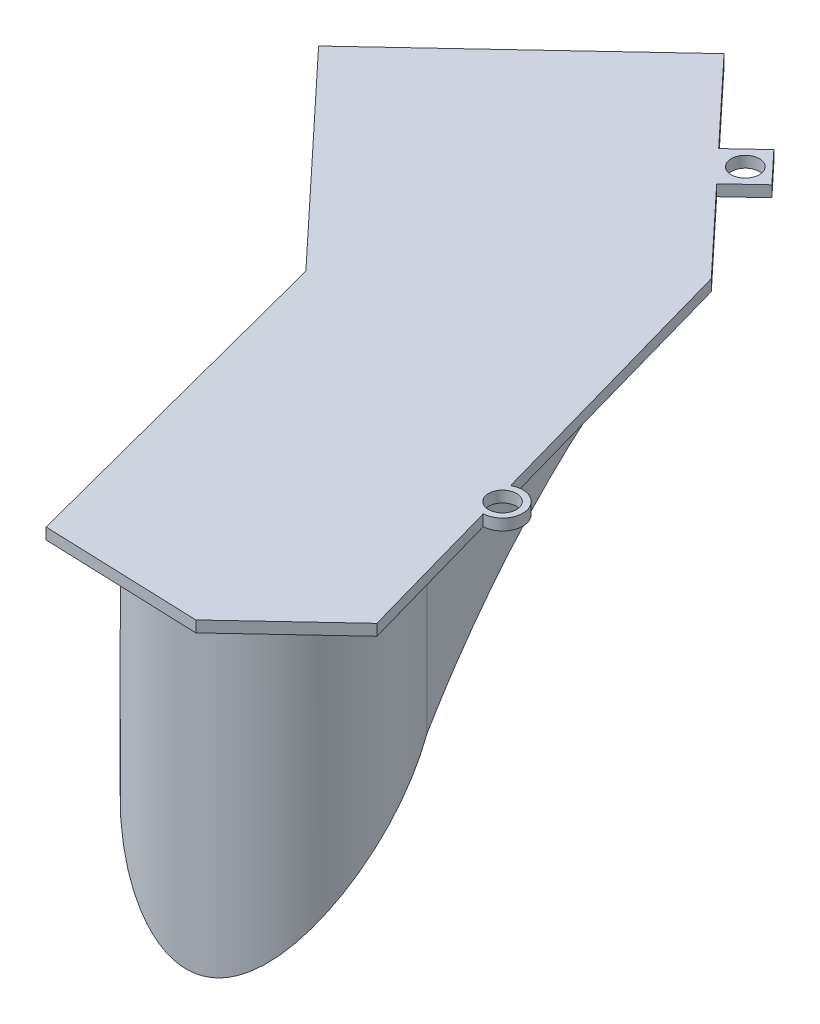
ISO-10303-21;
HEADER;
FILE_DESCRIPTION(('STEP AP214'),'2;1');
FILE_NAME('part.step','',(''),(''),'','','');
FILE_SCHEMA(('AUTOMOTIVE_DESIGN { 1 0 10303 214 1 1 1 1 }'));
ENDSEC;
DATA;
#1=APPLICATION_CONTEXT('core data for automotive mechanical design processes');
#2=APPLICATION_PROTOCOL_DEFINITION('international standard','automotive_design',2000,#1);
#3=PRODUCT_CONTEXT('',#1,'mechanical');
#4=PRODUCT('Part','Part','',(#3));
#5=PRODUCT_RELATED_PRODUCT_CATEGORY('part','',(#4));
#6=PRODUCT_DEFINITION_FORMATION('','',#4);
#7=PRODUCT_DEFINITION_CONTEXT('part definition',#1,'design');
#8=PRODUCT_DEFINITION('design','',#6,#7);
#9=PRODUCT_DEFINITION_SHAPE('','',#8);
#10=(LENGTH_UNIT() NAMED_UNIT(*) SI_UNIT(.MILLI.,.METRE.));
#11=(NAMED_UNIT(*) PLANE_ANGLE_UNIT() SI_UNIT($,.RADIAN.));
#12=(NAMED_UNIT(*) SI_UNIT($,.STERADIAN.) SOLID_ANGLE_UNIT());
#13=UNCERTAINTY_MEASURE_WITH_UNIT(LENGTH_MEASURE(1.E-05),#10,'distance_accuracy_value','');
#14=(GEOMETRIC_REPRESENTATION_CONTEXT(3) GLOBAL_UNCERTAINTY_ASSIGNED_CONTEXT((#13)) GLOBAL_UNIT_ASSIGNED_CONTEXT((#10,
#11,#12)) REPRESENTATION_CONTEXT('',''));
#15=CARTESIAN_POINT('',(0.,0.,0.));
#16=DIRECTION('',(0.,0.,1.));
#17=DIRECTION('',(1.,0.,0.));
#18=AXIS2_PLACEMENT_3D('',#15,#16,#17);
#19=CARTESIAN_POINT('',(109.633944272676,2.54,-22.6148228302141));
#20=DIRECTION('',(0.,1.,0.));
#21=DIRECTION('',(0.,0.,1.));
#22=AXIS2_PLACEMENT_3D('',#19,#20,#21);
#23=PLANE('',#22);
#24=CARTESIAN_POINT('',(71.405004974618,2.54,-115.884998779653));
#25=DIRECTION('',(0.,1.,0.));
#26=DIRECTION('',(0.,0.,1.));
#27=AXIS2_PLACEMENT_3D('',#24,#25,#26);
#28=CIRCLE('',#27,3.17500000000004);
#29=CARTESIAN_POINT('',(71.405004974618,2.54,-112.709998779653));
#30=VERTEX_POINT('',#29);
#31=EDGE_CURVE('E171',#30,#30,#28,.T.);
#32=ORIENTED_EDGE('',*,*,#31,.F.);
#33=EDGE_LOOP('',(#32));
#34=FACE_BOUND('',#33,.T.);
#35=DIRECTION('',(-0.729853070223345,0.,0.683604049055853));
#36=VECTOR('',#35,1.);
#37=CARTESIAN_POINT('',(46.8036282166022,2.54,-135.674028664743));
#38=LINE('',#37,#36);
#39=CARTESIAN_POINT('',(46.8036282166022,2.54,-135.674028664743));
#40=VERTEX_POINT('',#39);
#41=CARTESIAN_POINT('',(-0.667272367114391,2.54,-91.2112440642401));
#42=VERTEX_POINT('',#41);
#43=EDGE_CURVE('E192',#40,#42,#38,.T.);
#44=ORIENTED_EDGE('',*,*,#43,.T.);
#45=DIRECTION('',(0.683604049055853,0.,0.729853070223345));
#46=VECTOR('',#45,1.);
#47=CARTESIAN_POINT('',(-0.667272367114391,2.54,-91.2112440642401));
#48=LINE('',#47,#46);
#49=CARTESIAN_POINT('',(42.072585982005,2.54,-45.5798337762256));
#50=VERTEX_POINT('',#49);
#51=EDGE_CURVE('E113',#42,#50,#48,.T.);
#52=ORIENTED_EDGE('',*,*,#51,.T.);
#53=DIRECTION('',(0.252771208119308,0.,0.967526080447398));
#54=VECTOR('',#53,1.);
#55=CARTESIAN_POINT('',(42.072585982005,2.54,-45.5798337762256));
#56=LINE('',#55,#54);
#57=CARTESIAN_POINT('',(62.9001992959471,2.54,34.1415048392114));
#58=VERTEX_POINT('',#57);
#59=EDGE_CURVE('E300',#50,#58,#56,.T.);
#60=ORIENTED_EDGE('',*,*,#59,.T.);
#61=DIRECTION('',(0.999343312990486,0.,0.0362345523112806));
#62=VECTOR('',#61,1.);
#63=CARTESIAN_POINT('',(62.9001992959471,2.54,34.1415048392114));
#64=LINE('',#63,#62);
#65=CARTESIAN_POINT('',(98.1134511877565,2.54,35.4182796983996));
#66=VERTEX_POINT('',#65);
#67=EDGE_CURVE('E302',#58,#66,#64,.T.);
#68=ORIENTED_EDGE('',*,*,#67,.T.);
#69=DIRECTION('',(0.729853070223345,0.,-0.683604049055854));
#70=VECTOR('',#69,1.);
#71=CARTESIAN_POINT('',(98.1134511877565,2.54,35.4182796983996));
#72=LINE('',#71,#70);
#73=CARTESIAN_POINT('',(119.317385981979,2.54,15.5579868906825));
#74=VERTEX_POINT('',#73);
#75=EDGE_CURVE('E304',#66,#74,#72,.T.);
#76=ORIENTED_EDGE('',*,*,#75,.T.);
#77=DIRECTION('',(-0.27136827073141,0.,-0.962475590152937));
#78=VECTOR('',#77,1.);
#79=CARTESIAN_POINT('',(119.317385981979,2.54,15.5579868906825));
#80=LINE('',#79,#78);
#81=CARTESIAN_POINT('',(109.850299083421,2.54,-18.0194097045804));
#82=VERTEX_POINT('',#81);
#83=EDGE_CURVE('E306',#74,#82,#80,.T.);
#84=ORIENTED_EDGE('',*,*,#83,.T.);
#85=CARTESIAN_POINT('',(109.633944272676,2.54,-22.6148228302141));
#86=DIRECTION('',(0.,1.,0.));
#87=DIRECTION('',(0.,0.,1.));
#88=AXIS2_PLACEMENT_3D('',#85,#86,#87);
#89=CIRCLE('',#88,4.60050336369612);
#90=CARTESIAN_POINT('',(107.417924980056,2.54,-26.6464341326728));
#91=VERTEX_POINT('',#90);
#92=EDGE_CURVE('E308',#82,#91,#89,.T.);
#93=ORIENTED_EDGE('',*,*,#92,.T.);
#94=DIRECTION('',(-0.271368270731411,0.,-0.962475590152936));
#95=VECTOR('',#94,1.);
#96=CARTESIAN_POINT('',(107.417924980056,2.54,-26.6464341326728));
#97=LINE('',#96,#95);
#98=CARTESIAN_POINT('',(89.5434832542424,2.54,-90.042621912245));
#99=VERTEX_POINT('',#98);
#100=EDGE_CURVE('E310',#91,#99,#97,.T.);
#101=ORIENTED_EDGE('',*,*,#100,.T.);
#102=DIRECTION('',(-0.683604049055853,0.,-0.729853070223345));
#103=VECTOR('',#102,1.);
#104=CARTESIAN_POINT('',(89.5434832542424,2.54,-90.042621912245));
#105=LINE('',#104,#103);
#106=CARTESIAN_POINT('',(71.515910095554,2.54,-109.289844974655));
#107=VERTEX_POINT('',#106);
#108=EDGE_CURVE('E312',#99,#107,#105,.T.);
#109=ORIENTED_EDGE('',*,*,#108,.T.);
#110=DIRECTION('',(0.729853070223344,0.,-0.683604049055854));
#111=VECTOR('',#110,1.);
#112=CARTESIAN_POINT('',(71.515910095554,2.54,-109.289844974655));
#113=LINE('',#112,#111);
#114=CARTESIAN_POINT('',(77.9786055262348,2.54,-115.34301505021));
#115=VERTEX_POINT('',#114);
#116=EDGE_CURVE('E149',#107,#115,#113,.T.);
#117=ORIENTED_EDGE('',*,*,#116,.T.);
#118=DIRECTION('',(-0.683604049055854,0.,-0.729853070223344));
#119=VECTOR('',#118,1.);
#120=CARTESIAN_POINT('',(77.9786055262348,2.54,-115.34301505021));
#121=LINE('',#120,#119);
#122=CARTESIAN_POINT('',(71.2938968059717,2.54,-122.479975677888));
#123=VERTEX_POINT('',#122);
#124=EDGE_CURVE('E143',#115,#123,#121,.T.);
#125=ORIENTED_EDGE('',*,*,#124,.T.);
#126=DIRECTION('',(-0.729853070223345,0.,0.683604049055852));
#127=VECTOR('',#126,1.);
#128=CARTESIAN_POINT('',(71.2938968059717,2.54,-122.479975677888));
#129=LINE('',#128,#127);
#130=CARTESIAN_POINT('',(64.8312013752909,2.54,-116.426805602333));
#131=VERTEX_POINT('',#130);
#132=EDGE_CURVE('E147',#123,#131,#129,.T.);
#133=ORIENTED_EDGE('',*,*,#132,.T.);
#134=DIRECTION('',(-0.683604049055852,0.,-0.729853070223345));
#135=VECTOR('',#134,1.);
#136=CARTESIAN_POINT('',(64.8312013752909,2.54,-116.426805602333));
#137=LINE('',#136,#135);
#138=EDGE_CURVE('E53',#131,#40,#137,.T.);
#139=ORIENTED_EDGE('',*,*,#138,.T.);
#140=EDGE_LOOP('',(#44,#52,#60,#68,#76,#84,#93,#101,#109,#117,#125,#133,#139));
#141=FACE_BOUND('',#140,.T.);
#142=CARTESIAN_POINT('',(109.633944272676,2.54,-22.6148228302141));
#143=DIRECTION('',(0.,1.,0.));
#144=DIRECTION('',(0.,0.,1.));
#145=AXIS2_PLACEMENT_3D('',#142,#143,#144);
#146=CIRCLE('',#145,3.175);
#147=CARTESIAN_POINT('',(109.633944272676,2.54,-19.4398228302142));
#148=VERTEX_POINT('',#147);
#149=EDGE_CURVE('E287',#148,#148,#146,.T.);
#150=ORIENTED_EDGE('',*,*,#149,.F.);
#151=EDGE_LOOP('',(#150));
#152=FACE_BOUND('',#151,.T.);
#153=ADVANCED_FACE('F36',(#34,#141,#152),#23,.T.);
#154=CARTESIAN_POINT('',(109.633944272676,0.,-22.6148228302141));
#155=DIRECTION('',(0.,1.,0.));
#156=DIRECTION('',(0.,0.,1.));
#157=AXIS2_PLACEMENT_3D('',#154,#155,#156);
#158=PLANE('',#157);
#159=DIRECTION('',(-0.967526080447398,0.,0.252771208119308));
#160=VECTOR('',#159,1.);
#161=CARTESIAN_POINT('',(131.524213127208,0.,-88.9502593304301));
#162=LINE('',#161,#160);
#163=CARTESIAN_POINT('',(89.0058553055579,0.,-77.8421177608945));
#164=VERTEX_POINT('',#163);
#165=CARTESIAN_POINT('',(31.7878535270042,0.,-62.8936179446934));
#166=VERTEX_POINT('',#165);
#167=EDGE_CURVE('E239',#164,#166,#162,.T.);
#168=ORIENTED_EDGE('',*,*,#167,.T.);
#169=DIRECTION('',(0.683604049055853,0.,0.729853070223345));
#170=VECTOR('',#169,1.);
#171=CARTESIAN_POINT('',(88.2627801310738,0.,-2.5978975937881));
#172=LINE('',#171,#170);
#173=CARTESIAN_POINT('',(46.3531149335174,0.,-47.3429482685389));
#174=VERTEX_POINT('',#173);
#175=EDGE_CURVE('E222',#166,#174,#172,.T.);
#176=ORIENTED_EDGE('',*,*,#175,.T.);
#177=DIRECTION('',(0.247619469659392,0.,0.968857367338248));
#178=VECTOR('',#177,1.);
#179=CARTESIAN_POINT('',(56.1656782266344,0.,-8.9494638947684));
#180=LINE('',#179,#178);
#181=CARTESIAN_POINT('',(61.1366862999049,0.,10.500532511051));
#182=VERTEX_POINT('',#181);
#183=EDGE_CURVE('E225',#174,#182,#180,.T.);
#184=ORIENTED_EDGE('',*,*,#183,.T.);
#185=CARTESIAN_POINT('',(85.7747393565074,0.,4.32587935641606));
#186=DIRECTION('',(0.,1.,0.));
#187=DIRECTION('',(0.,0.,1.));
#188=AXIS2_PLACEMENT_3D('',#185,#186,#187);
#189=CIRCLE('',#188,25.4);
#190=CARTESIAN_POINT('',(108.844487247154,0.,-6.30176065733969));
#191=VERTEX_POINT('',#190);
#192=EDGE_CURVE('E228',#182,#191,#189,.T.);
#193=ORIENTED_EDGE('',*,*,#192,.T.);
#194=DIRECTION('',(-0.267222553945674,0.,-0.963634840934444));
#195=VECTOR('',#194,1.);
#196=CARTESIAN_POINT('',(104.700166234653,0.,-21.2466523242129));
#197=LINE('',#196,#195);
#198=EDGE_CURVE('E45',#191,#164,#197,.T.);
#199=ORIENTED_EDGE('',*,*,#198,.T.);
#200=EDGE_LOOP('',(#168,#176,#184,#193,#199));
#201=FACE_BOUND('',#200,.T.);
#202=DIRECTION('',(0.252771208119308,0.,0.967526080447398));
#203=VECTOR('',#202,1.);
#204=CARTESIAN_POINT('',(42.072585982005,0.,-45.5798337762256));
#205=LINE('',#204,#203);
#206=CARTESIAN_POINT('',(42.072585982005,0.,-45.5798337762256));
#207=VERTEX_POINT('',#206);
#208=CARTESIAN_POINT('',(62.9001992959471,0.,34.1415048392114));
#209=VERTEX_POINT('',#208);
#210=EDGE_CURVE('E173',#207,#209,#205,.T.);
#211=ORIENTED_EDGE('',*,*,#210,.F.);
#212=DIRECTION('',(0.683604049055853,0.,0.729853070223345));
#213=VECTOR('',#212,1.);
#214=CARTESIAN_POINT('',(-0.667272367114391,0.,-91.2112440642401));
#215=LINE('',#214,#213);
#216=CARTESIAN_POINT('',(-0.667272367114391,0.,-91.2112440642401));
#217=VERTEX_POINT('',#216);
#218=EDGE_CURVE('E170',#217,#207,#215,.T.);
#219=ORIENTED_EDGE('',*,*,#218,.F.);
#220=DIRECTION('',(-0.729853070223345,0.,0.683604049055853));
#221=VECTOR('',#220,1.);
#222=CARTESIAN_POINT('',(46.8036282166022,0.,-135.674028664743));
#223=LINE('',#222,#221);
#224=CARTESIAN_POINT('',(46.8036282166022,0.,-135.674028664743));
#225=VERTEX_POINT('',#224);
#226=EDGE_CURVE('E167',#225,#217,#223,.T.);
#227=ORIENTED_EDGE('',*,*,#226,.F.);
#228=DIRECTION('',(-0.683604049055852,0.,-0.729853070223345));
#229=VECTOR('',#228,1.);
#230=CARTESIAN_POINT('',(64.8312013752909,0.,-116.426805602333));
#231=LINE('',#230,#229);
#232=CARTESIAN_POINT('',(64.8312013752909,0.,-116.426805602333));
#233=VERTEX_POINT('',#232);
#234=EDGE_CURVE('E104',#233,#225,#231,.T.);
#235=ORIENTED_EDGE('',*,*,#234,.F.);
#236=DIRECTION('',(-0.729853070223345,0.,0.683604049055852));
#237=VECTOR('',#236,1.);
#238=CARTESIAN_POINT('',(71.2938968059717,0.,-122.479975677888));
#239=LINE('',#238,#237);
#240=CARTESIAN_POINT('',(71.2938968059717,0.,-122.479975677888));
#241=VERTEX_POINT('',#240);
#242=EDGE_CURVE('E98',#241,#233,#239,.T.);
#243=ORIENTED_EDGE('',*,*,#242,.F.);
#244=DIRECTION('',(-0.683604049055854,0.,-0.729853070223344));
#245=VECTOR('',#244,1.);
#246=CARTESIAN_POINT('',(77.9786055262348,0.,-115.34301505021));
#247=LINE('',#246,#245);
#248=CARTESIAN_POINT('',(77.9786055262348,0.,-115.34301505021));
#249=VERTEX_POINT('',#248);
#250=EDGE_CURVE('E157',#249,#241,#247,.T.);
#251=ORIENTED_EDGE('',*,*,#250,.F.);
#252=DIRECTION('',(0.729853070223344,0.,-0.683604049055854));
#253=VECTOR('',#252,1.);
#254=CARTESIAN_POINT('',(71.515910095554,0.,-109.289844974655));
#255=LINE('',#254,#253);
#256=CARTESIAN_POINT('',(71.515910095554,0.,-109.289844974655));
#257=VERTEX_POINT('',#256);
#258=EDGE_CURVE('E187',#257,#249,#255,.T.);
#259=ORIENTED_EDGE('',*,*,#258,.F.);
#260=DIRECTION('',(-0.683604049055853,0.,-0.729853070223345));
#261=VECTOR('',#260,1.);
#262=CARTESIAN_POINT('',(89.5434832542424,0.,-90.042621912245));
#263=LINE('',#262,#261);
#264=CARTESIAN_POINT('',(89.5434832542424,0.,-90.042621912245));
#265=VERTEX_POINT('',#264);
#266=EDGE_CURVE('E185',#265,#257,#263,.T.);
#267=ORIENTED_EDGE('',*,*,#266,.F.);
#268=DIRECTION('',(-0.271368270731411,0.,-0.962475590152936));
#269=VECTOR('',#268,1.);
#270=CARTESIAN_POINT('',(107.417924980056,0.,-26.6464341326728));
#271=LINE('',#270,#269);
#272=CARTESIAN_POINT('',(107.417924980056,0.,-26.6464341326728));
#273=VERTEX_POINT('',#272);
#274=EDGE_CURVE('E183',#273,#265,#271,.T.);
#275=ORIENTED_EDGE('',*,*,#274,.F.);
#276=CARTESIAN_POINT('',(109.633944272676,0.,-22.6148228302141));
#277=DIRECTION('',(0.,1.,0.));
#278=DIRECTION('',(0.,0.,1.));
#279=AXIS2_PLACEMENT_3D('',#276,#277,#278);
#280=CIRCLE('',#279,4.60050336369612);
#281=CARTESIAN_POINT('',(109.850299083421,0.,-18.0194097045804));
#282=VERTEX_POINT('',#281);
#283=EDGE_CURVE('E181',#282,#273,#280,.T.);
#284=ORIENTED_EDGE('',*,*,#283,.F.);
#285=DIRECTION('',(-0.27136827073141,0.,-0.962475590152937));
#286=VECTOR('',#285,1.);
#287=CARTESIAN_POINT('',(119.317385981979,0.,15.5579868906825));
#288=LINE('',#287,#286);
#289=CARTESIAN_POINT('',(119.317385981979,0.,15.5579868906825));
#290=VERTEX_POINT('',#289);
#291=EDGE_CURVE('E179',#290,#282,#288,.T.);
#292=ORIENTED_EDGE('',*,*,#291,.F.);
#293=DIRECTION('',(0.729853070223345,0.,-0.683604049055854));
#294=VECTOR('',#293,1.);
#295=CARTESIAN_POINT('',(98.1134511877565,0.,35.4182796983996));
#296=LINE('',#295,#294);
#297=CARTESIAN_POINT('',(98.1134511877565,0.,35.4182796983996));
#298=VERTEX_POINT('',#297);
#299=EDGE_CURVE('E177',#298,#290,#296,.T.);
#300=ORIENTED_EDGE('',*,*,#299,.F.);
#301=DIRECTION('',(0.999343312990486,0.,0.0362345523112806));
#302=VECTOR('',#301,1.);
#303=CARTESIAN_POINT('',(62.9001992959471,0.,34.1415048392114));
#304=LINE('',#303,#302);
#305=EDGE_CURVE('E175',#209,#298,#304,.T.);
#306=ORIENTED_EDGE('',*,*,#305,.F.);
#307=EDGE_LOOP('',(#211,#219,#227,#235,#243,#251,#259,#267,#275,#284,#292,#300,#306));
#308=FACE_BOUND('',#307,.T.);
#309=CARTESIAN_POINT('',(109.633944272676,0.,-22.6148228302141));
#310=DIRECTION('',(0.,1.,0.));
#311=DIRECTION('',(0.,0.,1.));
#312=AXIS2_PLACEMENT_3D('',#309,#310,#311);
#313=CIRCLE('',#312,3.175);
#314=CARTESIAN_POINT('',(109.633944272676,0.,-19.4398228302142));
#315=VERTEX_POINT('',#314);
#316=EDGE_CURVE('E291',#315,#315,#313,.T.);
#317=ORIENTED_EDGE('',*,*,#316,.T.);
#318=EDGE_LOOP('',(#317));
#319=FACE_BOUND('',#318,.T.);
#320=CARTESIAN_POINT('',(71.405004974618,0.,-115.884998779653));
#321=DIRECTION('',(0.,1.,0.));
#322=DIRECTION('',(0.,0.,1.));
#323=AXIS2_PLACEMENT_3D('',#320,#321,#322);
#324=CIRCLE('',#323,3.17500000000004);
#325=CARTESIAN_POINT('',(71.405004974618,0.,-112.709998779653));
#326=VERTEX_POINT('',#325);
#327=EDGE_CURVE('E290',#326,#326,#324,.T.);
#328=ORIENTED_EDGE('',*,*,#327,.T.);
#329=EDGE_LOOP('',(#328));
#330=FACE_BOUND('',#329,.T.);
#331=ADVANCED_FACE('F235',(#201,#308,#319,#330),#158,.F.);
#332=CARTESIAN_POINT('',(46.8036282166022,2.54,-135.674028664743));
#333=DIRECTION('',(0.683604049055853,0.,0.729853070223345));
#334=DIRECTION('',(0.729853070223345,0.,-0.683604049055853));
#335=AXIS2_PLACEMENT_3D('',#332,#333,#334);
#336=PLANE('',#335);
#337=ORIENTED_EDGE('',*,*,#226,.T.);
#338=DIRECTION('',(0.,-1.,0.));
#339=VECTOR('',#338,1.);
#340=CARTESIAN_POINT('',(-0.667272367114391,2.54,-91.2112440642401));
#341=LINE('',#340,#339);
#342=EDGE_CURVE('E220',#42,#217,#341,.T.);
#343=ORIENTED_EDGE('',*,*,#342,.F.);
#344=ORIENTED_EDGE('',*,*,#43,.F.);
#345=DIRECTION('',(0.,-1.,0.));
#346=VECTOR('',#345,1.);
#347=CARTESIAN_POINT('',(46.8036282166022,2.54,-135.674028664743));
#348=LINE('',#347,#346);
#349=EDGE_CURVE('E163',#40,#225,#348,.T.);
#350=ORIENTED_EDGE('',*,*,#349,.T.);
#351=EDGE_LOOP('',(#337,#343,#344,#350));
#352=FACE_BOUND('',#351,.T.);
#353=ADVANCED_FACE('F38',(#352),#336,.F.);
#354=CARTESIAN_POINT('',(-0.667272367114391,2.54,-91.2112440642401));
#355=DIRECTION('',(0.729853070223345,0.,-0.683604049055853));
#356=DIRECTION('',(-0.683604049055853,0.,-0.729853070223345));
#357=AXIS2_PLACEMENT_3D('',#354,#355,#356);
#358=PLANE('',#357);
#359=ORIENTED_EDGE('',*,*,#218,.T.);
#360=DIRECTION('',(0.,-1.,0.));
#361=VECTOR('',#360,1.);
#362=CARTESIAN_POINT('',(42.072585982005,2.54,-45.5798337762256));
#363=LINE('',#362,#361);
#364=EDGE_CURVE('E217',#50,#207,#363,.T.);
#365=ORIENTED_EDGE('',*,*,#364,.F.);
#366=ORIENTED_EDGE('',*,*,#51,.F.);
#367=ORIENTED_EDGE('',*,*,#342,.T.);
#368=EDGE_LOOP('',(#359,#365,#366,#367));
#369=FACE_BOUND('',#368,.T.);
#370=ADVANCED_FACE('F486',(#369),#358,.F.);
#371=CARTESIAN_POINT('',(42.072585982005,2.54,-45.5798337762256));
#372=DIRECTION('',(0.967526080447398,0.,-0.252771208119308));
#373=DIRECTION('',(-0.252771208119308,0.,-0.967526080447398));
#374=AXIS2_PLACEMENT_3D('',#371,#372,#373);
#375=PLANE('',#374);
#376=ORIENTED_EDGE('',*,*,#210,.T.);
#377=DIRECTION('',(0.,-1.,0.));
#378=VECTOR('',#377,1.);
#379=CARTESIAN_POINT('',(62.9001992959471,2.54,34.1415048392114));
#380=LINE('',#379,#378);
#381=EDGE_CURVE('E214',#58,#209,#380,.T.);
#382=ORIENTED_EDGE('',*,*,#381,.F.);
#383=ORIENTED_EDGE('',*,*,#59,.F.);
#384=ORIENTED_EDGE('',*,*,#364,.T.);
#385=EDGE_LOOP('',(#376,#382,#383,#384));
#386=FACE_BOUND('',#385,.T.);
#387=ADVANCED_FACE('F476',(#386),#375,.F.);
#388=CARTESIAN_POINT('',(62.9001992959471,2.54,34.1415048392114));
#389=DIRECTION('',(0.0362345523112806,0.,-0.999343312990486));
#390=DIRECTION('',(-0.999343312990486,0.,-0.0362345523112806));
#391=AXIS2_PLACEMENT_3D('',#388,#389,#390);
#392=PLANE('',#391);
#393=ORIENTED_EDGE('',*,*,#305,.T.);
#394=DIRECTION('',(0.,-1.,0.));
#395=VECTOR('',#394,1.);
#396=CARTESIAN_POINT('',(98.1134511877565,2.54,35.4182796983996));
#397=LINE('',#396,#395);
#398=EDGE_CURVE('E211',#66,#298,#397,.T.);
#399=ORIENTED_EDGE('',*,*,#398,.F.);
#400=ORIENTED_EDGE('',*,*,#67,.F.);
#401=ORIENTED_EDGE('',*,*,#381,.T.);
#402=EDGE_LOOP('',(#393,#399,#400,#401));
#403=FACE_BOUND('',#402,.T.);
#404=ADVANCED_FACE('F466',(#403),#392,.F.);
#405=CARTESIAN_POINT('',(98.1134511877565,2.54,35.4182796983996));
#406=DIRECTION('',(-0.683604049055853,0.,-0.729853070223345));
#407=DIRECTION('',(-0.729853070223345,0.,0.683604049055853));
#408=AXIS2_PLACEMENT_3D('',#405,#406,#407);
#409=PLANE('',#408);
#410=ORIENTED_EDGE('',*,*,#299,.T.);
#411=DIRECTION('',(0.,-1.,0.));
#412=VECTOR('',#411,1.);
#413=CARTESIAN_POINT('',(119.317385981979,2.54,15.5579868906825));
#414=LINE('',#413,#412);
#415=EDGE_CURVE('E208',#74,#290,#414,.T.);
#416=ORIENTED_EDGE('',*,*,#415,.F.);
#417=ORIENTED_EDGE('',*,*,#75,.F.);
#418=ORIENTED_EDGE('',*,*,#398,.T.);
#419=EDGE_LOOP('',(#410,#416,#417,#418));
#420=FACE_BOUND('',#419,.T.);
#421=ADVANCED_FACE('F456',(#420),#409,.F.);
#422=CARTESIAN_POINT('',(119.317385981979,2.54,15.5579868906825));
#423=DIRECTION('',(-0.962475590152937,0.,0.27136827073141));
#424=DIRECTION('',(0.27136827073141,0.,0.962475590152937));
#425=AXIS2_PLACEMENT_3D('',#422,#423,#424);
#426=PLANE('',#425);
#427=ORIENTED_EDGE('',*,*,#291,.T.);
#428=DIRECTION('',(0.,-1.,0.));
#429=VECTOR('',#428,1.);
#430=CARTESIAN_POINT('',(109.850299083421,2.54,-18.0194097045804));
#431=LINE('',#430,#429);
#432=EDGE_CURVE('E205',#82,#282,#431,.T.);
#433=ORIENTED_EDGE('',*,*,#432,.F.);
#434=ORIENTED_EDGE('',*,*,#83,.F.);
#435=ORIENTED_EDGE('',*,*,#415,.T.);
#436=EDGE_LOOP('',(#427,#433,#434,#435));
#437=FACE_BOUND('',#436,.T.);
#438=ADVANCED_FACE('F446',(#437),#426,.F.);
#439=CARTESIAN_POINT('',(109.633944272676,2.54,-22.6148228302141));
#440=DIRECTION('',(0.,-1.,0.));
#441=DIRECTION('',(0.,0.,-1.));
#442=AXIS2_PLACEMENT_3D('',#439,#440,#441);
#443=CYLINDRICAL_SURFACE('',#442,4.60050336369612);
#444=ORIENTED_EDGE('',*,*,#283,.T.);
#445=DIRECTION('',(0.,-1.,0.));
#446=VECTOR('',#445,1.);
#447=CARTESIAN_POINT('',(107.417924980056,2.54,-26.6464341326728));
#448=LINE('',#447,#446);
#449=EDGE_CURVE('E202',#91,#273,#448,.T.);
#450=ORIENTED_EDGE('',*,*,#449,.F.);
#451=ORIENTED_EDGE('',*,*,#92,.F.);
#452=ORIENTED_EDGE('',*,*,#432,.T.);
#453=EDGE_LOOP('',(#444,#450,#451,#452));
#454=FACE_BOUND('',#453,.T.);
#455=ADVANCED_FACE('F441',(#454),#443,.T.);
#456=CARTESIAN_POINT('',(107.417924980056,2.54,-26.6464341326728));
#457=DIRECTION('',(-0.962475590152937,0.,0.271368270731411));
#458=DIRECTION('',(0.271368270731411,0.,0.962475590152937));
#459=AXIS2_PLACEMENT_3D('',#456,#457,#458);
#460=PLANE('',#459);
#461=ORIENTED_EDGE('',*,*,#274,.T.);
#462=DIRECTION('',(0.,-1.,0.));
#463=VECTOR('',#462,1.);
#464=CARTESIAN_POINT('',(89.5434832542424,2.54,-90.042621912245));
#465=LINE('',#464,#463);
#466=EDGE_CURVE('E199',#99,#265,#465,.T.);
#467=ORIENTED_EDGE('',*,*,#466,.F.);
#468=ORIENTED_EDGE('',*,*,#100,.F.);
#469=ORIENTED_EDGE('',*,*,#449,.T.);
#470=EDGE_LOOP('',(#461,#467,#468,#469));
#471=FACE_BOUND('',#470,.T.);
#472=ADVANCED_FACE('F434',(#471),#460,.F.);
#473=CARTESIAN_POINT('',(89.5434832542424,2.54,-90.042621912245));
#474=DIRECTION('',(-0.729853070223345,0.,0.683604049055853));
#475=DIRECTION('',(0.683604049055853,0.,0.729853070223345));
#476=AXIS2_PLACEMENT_3D('',#473,#474,#475);
#477=PLANE('',#476);
#478=ORIENTED_EDGE('',*,*,#266,.T.);
#479=DIRECTION('',(0.,-1.,0.));
#480=VECTOR('',#479,1.);
#481=CARTESIAN_POINT('',(71.515910095554,2.54,-109.289844974655));
#482=LINE('',#481,#480);
#483=EDGE_CURVE('E196',#107,#257,#482,.T.);
#484=ORIENTED_EDGE('',*,*,#483,.F.);
#485=ORIENTED_EDGE('',*,*,#108,.F.);
#486=ORIENTED_EDGE('',*,*,#466,.T.);
#487=EDGE_LOOP('',(#478,#484,#485,#486));
#488=FACE_BOUND('',#487,.T.);
#489=ADVANCED_FACE('F318',(#488),#477,.F.);
#490=CARTESIAN_POINT('',(71.515910095554,2.54,-109.289844974655));
#491=DIRECTION('',(-0.683604049055854,0.,-0.729853070223344));
#492=DIRECTION('',(-0.729853070223344,0.,0.683604049055854));
#493=AXIS2_PLACEMENT_3D('',#490,#491,#492);
#494=PLANE('',#493);
#495=ORIENTED_EDGE('',*,*,#258,.T.);
#496=DIRECTION('',(0.,-1.,0.));
#497=VECTOR('',#496,1.);
#498=CARTESIAN_POINT('',(77.9786055262348,2.54,-115.34301505021));
#499=LINE('',#498,#497);
#500=EDGE_CURVE('E158',#115,#249,#499,.T.);
#501=ORIENTED_EDGE('',*,*,#500,.F.);
#502=ORIENTED_EDGE('',*,*,#116,.F.);
#503=ORIENTED_EDGE('',*,*,#483,.T.);
#504=EDGE_LOOP('',(#495,#501,#502,#503));
#505=FACE_BOUND('',#504,.T.);
#506=ADVANCED_FACE('F322',(#505),#494,.F.);
#507=CARTESIAN_POINT('',(77.9786055262348,2.54,-115.34301505021));
#508=DIRECTION('',(-0.729853070223344,0.,0.683604049055854));
#509=DIRECTION('',(0.683604049055854,0.,0.729853070223344));
#510=AXIS2_PLACEMENT_3D('',#507,#508,#509);
#511=PLANE('',#510);
#512=ORIENTED_EDGE('',*,*,#250,.T.);
#513=DIRECTION('',(0.,-1.,0.));
#514=VECTOR('',#513,1.);
#515=CARTESIAN_POINT('',(71.2938968059717,2.54,-122.479975677888));
#516=LINE('',#515,#514);
#517=EDGE_CURVE('E154',#123,#241,#516,.T.);
#518=ORIENTED_EDGE('',*,*,#517,.F.);
#519=ORIENTED_EDGE('',*,*,#124,.F.);
#520=ORIENTED_EDGE('',*,*,#500,.T.);
#521=EDGE_LOOP('',(#512,#518,#519,#520));
#522=FACE_BOUND('',#521,.T.);
#523=ADVANCED_FACE('F155',(#522),#511,.F.);
#524=CARTESIAN_POINT('',(71.2938968059717,2.54,-122.479975677888));
#525=DIRECTION('',(0.683604049055853,0.,0.729853070223346));
#526=DIRECTION('',(0.729853070223345,0.,-0.683604049055852));
#527=AXIS2_PLACEMENT_3D('',#524,#525,#526);
#528=PLANE('',#527);
#529=ORIENTED_EDGE('',*,*,#242,.T.);
#530=DIRECTION('',(0.,-1.,0.));
#531=VECTOR('',#530,1.);
#532=CARTESIAN_POINT('',(64.8312013752909,2.54,-116.426805602333));
#533=LINE('',#532,#531);
#534=EDGE_CURVE('E159',#131,#233,#533,.T.);
#535=ORIENTED_EDGE('',*,*,#534,.F.);
#536=ORIENTED_EDGE('',*,*,#132,.F.);
#537=ORIENTED_EDGE('',*,*,#517,.T.);
#538=EDGE_LOOP('',(#529,#535,#536,#537));
#539=FACE_BOUND('',#538,.T.);
#540=ADVANCED_FACE('F161',(#539),#528,.F.);
#541=CARTESIAN_POINT('',(64.8312013752909,2.54,-116.426805602333));
#542=DIRECTION('',(-0.729853070223346,0.,0.683604049055853));
#543=DIRECTION('',(0.683604049055852,0.,0.729853070223345));
#544=AXIS2_PLACEMENT_3D('',#541,#542,#543);
#545=PLANE('',#544);
#546=ORIENTED_EDGE('',*,*,#234,.T.);
#547=ORIENTED_EDGE('',*,*,#349,.F.);
#548=ORIENTED_EDGE('',*,*,#138,.F.);
#549=ORIENTED_EDGE('',*,*,#534,.T.);
#550=EDGE_LOOP('',(#546,#547,#548,#549));
#551=FACE_BOUND('',#550,.T.);
#552=ADVANCED_FACE('F329',(#551),#545,.F.);
#553=CARTESIAN_POINT('',(71.405004974618,2.54,-115.884998779653));
#554=DIRECTION('',(0.,-1.,0.));
#555=DIRECTION('',(0.,0.,-1.));
#556=AXIS2_PLACEMENT_3D('',#553,#554,#555);
#557=CYLINDRICAL_SURFACE('',#556,3.17500000000004);
#558=ORIENTED_EDGE('',*,*,#31,.T.);
#559=EDGE_LOOP('',(#558));
#560=FACE_BOUND('',#559,.T.);
#561=ORIENTED_EDGE('',*,*,#327,.F.);
#562=EDGE_LOOP('',(#561));
#563=FACE_BOUND('',#562,.T.);
#564=ADVANCED_FACE('F331',(#560,#563),#557,.F.);
#565=CARTESIAN_POINT('',(109.633944272676,2.54,-22.6148228302141));
#566=DIRECTION('',(0.,-1.,0.));
#567=DIRECTION('',(0.,0.,-1.));
#568=AXIS2_PLACEMENT_3D('',#565,#566,#567);
#569=CYLINDRICAL_SURFACE('',#568,3.175);
#570=ORIENTED_EDGE('',*,*,#149,.T.);
#571=EDGE_LOOP('',(#570));
#572=FACE_BOUND('',#571,.T.);
#573=ORIENTED_EDGE('',*,*,#316,.F.);
#574=EDGE_LOOP('',(#573));
#575=FACE_BOUND('',#574,.T.);
#576=ADVANCED_FACE('F337',(#572,#575),#569,.F.);
#577=CARTESIAN_POINT('',(86.4107962943836,-73.66,-87.2001949161513));
#578=DIRECTION('',(0.963634840934444,0.,-0.267222553945674));
#579=DIRECTION('',(-0.267222553945674,0.,-0.963634840934444));
#580=AXIS2_PLACEMENT_3D('',#577,#578,#579);
#581=PLANE('',#580);
#582=CARTESIAN_POINT('',(83.3339506925619,-140.64779078871,-98.2956491669705));
#583=DIRECTION('',(0.963634840934444,0.,-0.267222553945674));
#584=DIRECTION('',(-0.267222553945674,0.,-0.963634840934444));
#585=AXIS2_PLACEMENT_3D('',#582,#583,#584);
#586=ELLIPSE('',#585,142.255931465188,142.24);
#587=CARTESIAN_POINT('',(108.844487247154,-35.1935552448705,-6.30176065733969));
#588=VERTEX_POINT('',#587);
#589=EDGE_CURVE('E251',#164,#588,#586,.T.);
#590=ORIENTED_EDGE('',*,*,#589,.F.);
#591=ORIENTED_EDGE('',*,*,#198,.F.);
#592=DIRECTION('',(0.,1.,0.));
#593=VECTOR('',#592,1.);
#594=CARTESIAN_POINT('',(108.844487247154,-73.66,-6.30176065733969));
#595=LINE('',#594,#593);
#596=EDGE_CURVE('E249',#588,#191,#595,.T.);
#597=ORIENTED_EDGE('',*,*,#596,.F.);
#598=EDGE_LOOP('',(#590,#591,#597));
#599=FACE_BOUND('',#598,.T.);
#600=ADVANCED_FACE('F246',(#599),#581,.T.);
#601=CARTESIAN_POINT('',(85.7747393565074,-73.66,4.32587935641606));
#602=DIRECTION('',(0.,1.,0.));
#603=DIRECTION('',(0.,0.,1.));
#604=AXIS2_PLACEMENT_3D('',#601,#602,#603);
#605=CYLINDRICAL_SURFACE('',#604,25.4);
#606=CARTESIAN_POINT('',(108.844487247154,-35.1935552448705,-6.30176065733969));
#607=CARTESIAN_POINT('',(109.052359063453,-35.6363114767097,-5.85049299644452));
#608=CARTESIAN_POINT('',(109.245221644835,-36.0837791983132,-5.39703486108077));
#609=CARTESIAN_POINT('',(109.601785375494,-36.9871191992423,-4.48722045196737));
#610=CARTESIAN_POINT('',(109.765492497462,-37.4429897360304,-4.0308647916793));
#611=CARTESIAN_POINT('',(110.064513613269,-38.3617669387545,-3.11708138501178));
#612=CARTESIAN_POINT('',(110.199860272834,-38.8246648438111,-2.65965549252124));
#613=CARTESIAN_POINT('',(110.443266829589,-39.7571481087015,-1.74437714639956));
#614=CARTESIAN_POINT('',(110.551325211297,-40.2267338384214,-1.28652467049432));
#615=CARTESIAN_POINT('',(110.835202577813,-41.6412403421509,0.0831248824272795));
#616=CARTESIAN_POINT('',(110.971731115108,-42.5950537228552,0.994143756345698));
#617=CARTESIAN_POINT('',(111.145657766177,-44.5202427582681,2.80720657597271));
#618=CARTESIAN_POINT('',(111.183023092716,-45.491624114781,3.70924745501888));
#619=CARTESIAN_POINT('',(111.163220999047,-47.4645230523949,5.51601665616017));
#620=CARTESIAN_POINT('',(111.104270904975,-48.4662643790598,6.42047920121018));
#621=CARTESIAN_POINT('',(110.892048252284,-50.4763031020013,8.21093578883979));
#622=CARTESIAN_POINT('',(110.73877615275,-51.4846004663447,9.09692992128734));
#623=CARTESIAN_POINT('',(110.439319565748,-52.9978400051971,10.4103134549503));
#624=CARTESIAN_POINT('',(110.327788284089,-53.5028031012014,10.8458601854784));
#625=CARTESIAN_POINT('',(110.081499794942,-54.511928218159,11.7112582390672));
#626=CARTESIAN_POINT('',(109.946744169529,-55.0160902913198,12.1411099479345));
#627=CARTESIAN_POINT('',(109.653891379183,-56.0226088682676,12.9947722403127));
#628=CARTESIAN_POINT('',(109.495797750827,-56.5249656338318,13.4185837284909));
#629=CARTESIAN_POINT('',(109.155934679492,-57.5268619833336,14.2599375769473));
#630=CARTESIAN_POINT('',(108.974166341598,-58.0264016976304,14.6774802288275));
#631=CARTESIAN_POINT('',(108.498502424756,-59.2471484469588,15.6939423543709));
#632=CARTESIAN_POINT('',(108.191136576794,-59.9661602930657,16.2892563681304));
#633=CARTESIAN_POINT('',(107.522700757058,-61.3913396764475,17.4652796340841));
#634=CARTESIAN_POINT('',(107.161627023607,-62.0975063101584,18.045987859962));
#635=CARTESIAN_POINT('',(106.577158711119,-63.1418119065119,18.9045891253707));
#636=CARTESIAN_POINT('',(106.375356732784,-63.4871751104111,19.1885089400769));
#637=CARTESIAN_POINT('',(105.956736357222,-64.1721479225832,19.7521646521523));
#638=CARTESIAN_POINT('',(105.739919160257,-64.5117579880463,20.0319008817737));
#639=CARTESIAN_POINT('',(105.290575466451,-65.1839961325496,20.5868624207529));
#640=CARTESIAN_POINT('',(105.058053953877,-65.5166263833357,20.8620891272122));
#641=CARTESIAN_POINT('',(104.576375212238,-66.1736030856537,21.4077681188285));
#642=CARTESIAN_POINT('',(104.327219580545,-66.4979503284786,21.6782208592843));
#643=CARTESIAN_POINT('',(103.759254039649,-67.2010815925631,22.267923125188));
#644=CARTESIAN_POINT('',(103.436521203215,-67.5776749982093,22.5860317901168));
#645=CARTESIAN_POINT('',(102.76350392896,-68.3129805299721,23.213804031202));
#646=CARTESIAN_POINT('',(102.413218532565,-68.6716920332538,23.523467313032));
#647=CARTESIAN_POINT('',(101.683063182275,-69.366366674103,24.1327221055356));
#648=CARTESIAN_POINT('',(101.303216333326,-69.7023472015428,24.4323212251819));
#649=CARTESIAN_POINT('',(100.511703899786,-70.3457300939063,25.0194748583811));
#650=CARTESIAN_POINT('',(100.100049086877,-70.65314205649,25.3070333990196));
#651=CARTESIAN_POINT('',(99.0562265217962,-71.3578899859124,25.9892262588822));
#652=CARTESIAN_POINT('',(98.4057727799753,-71.7365067692072,26.3762942904834));
#653=CARTESIAN_POINT('',(97.3771912381213,-72.2276711562562,26.9244194707531));
#654=CARTESIAN_POINT('',(97.0256774356507,-72.3785504447296,27.1016453783211));
#655=CARTESIAN_POINT('',(96.3054500812877,-72.6509986145094,27.4434655271588));
#656=CARTESIAN_POINT('',(95.9367402569704,-72.7725738131316,27.6080624857265));
#657=CARTESIAN_POINT('',(95.2491235841241,-72.9643772387769,27.8951353582025));
#658=CARTESIAN_POINT('',(94.9326589127512,-73.0398525955066,28.019967601204));
#659=CARTESIAN_POINT('',(94.2906460440538,-73.1662912851827,28.2582109426361));
#660=CARTESIAN_POINT('',(93.9650988479476,-73.2172573087242,28.3716232936428));
#661=CARTESIAN_POINT('',(93.307089426711,-73.2932539722822,28.5857914450825));
#662=CARTESIAN_POINT('',(92.9746314810165,-73.3183002020032,28.6865548212741));
#663=CARTESIAN_POINT('',(92.3049663968799,-73.3417812664507,28.8745468407113));
#664=CARTESIAN_POINT('',(91.9677591691441,-73.3402156001641,28.961775229107));
#665=CARTESIAN_POINT('',(91.2912419086134,-73.3105210153533,29.1220286163371));
#666=CARTESIAN_POINT('',(90.9519323944165,-73.2823984075811,29.1950569845646));
#667=CARTESIAN_POINT('',(90.2736526327364,-73.2004188262497,29.3266622916924));
#668=CARTESIAN_POINT('',(89.934682381613,-73.1465621318322,29.3852393873376));
#669=CARTESIAN_POINT('',(89.2590810758218,-73.0145283903658,29.488077553348));
#670=CARTESIAN_POINT('',(88.9224519659834,-72.9363331353774,29.5323278549514));
#671=CARTESIAN_POINT('',(88.2535965956596,-72.7575454353856,29.60687198715));
#672=CARTESIAN_POINT('',(87.9213715266855,-72.6569470551701,29.6371621127662));
#673=CARTESIAN_POINT('',(87.133572868137,-72.3920511280089,29.6936695507945));
#674=CARTESIAN_POINT('',(86.68073191387,-72.2182456474033,29.7136288772932));
#675=CARTESIAN_POINT('',(85.7888708634162,-71.8373223354636,29.7297961981807));
#676=CARTESIAN_POINT('',(85.3498564135585,-71.6301911005165,29.725994612552));
#677=CARTESIAN_POINT('',(84.4860282179967,-71.1877599837062,29.6968542611833));
#678=CARTESIAN_POINT('',(84.0612439248987,-70.9524058026495,29.6714733881481));
#679=CARTESIAN_POINT('',(83.2270763697495,-70.4587094326326,29.6012545857942));
#680=CARTESIAN_POINT('',(82.817693003631,-70.2003673990459,29.5564167879759));
#681=CARTESIAN_POINT('',(81.7318772457445,-69.4767812300644,29.4115678242233));
#682=CARTESIAN_POINT('',(81.0696106346774,-68.9935473255587,29.294918384339));
#683=CARTESIAN_POINT('',(79.7853353517509,-67.9875194203927,29.0183643686396));
#684=CARTESIAN_POINT('',(79.1633562228254,-67.4646969852861,28.8584284859862));
#685=CARTESIAN_POINT('',(77.9548215494365,-66.3890088900332,28.5003887998759));
#686=CARTESIAN_POINT('',(77.3683594518669,-65.8360706778887,28.302189606424));
#687=CARTESIAN_POINT('',(76.2294157136426,-64.7091603319254,27.871946359279));
#688=CARTESIAN_POINT('',(75.6769292301864,-64.1351912144999,27.6399071450311));
#689=CARTESIAN_POINT('',(74.6723416924803,-63.0466448942193,27.1767411515909));
#690=CARTESIAN_POINT('',(74.2164742973421,-62.5339353252716,26.9493432476656));
#691=CARTESIAN_POINT('',(73.3270291281039,-61.4994480578327,26.4724182629506));
#692=CARTESIAN_POINT('',(72.8934544139276,-60.9776691275511,26.2228881570063));
#693=CARTESIAN_POINT('',(72.0474044009067,-59.9270688164021,25.7026657113414));
#694=CARTESIAN_POINT('',(71.6349412725574,-59.3982435899799,25.4319613873576));
#695=CARTESIAN_POINT('',(70.8306748906956,-58.3356937603942,24.8703548150204));
#696=CARTESIAN_POINT('',(70.4388707544247,-57.8019693677181,24.5794534309197));
#697=CARTESIAN_POINT('',(69.675465321229,-56.7311485600417,23.9780919220735));
#698=CARTESIAN_POINT('',(69.3038633307043,-56.194052261516,23.6676324696058));
#699=CARTESIAN_POINT('',(68.5806339228646,-55.117777483217,23.0276411089171));
#700=CARTESIAN_POINT('',(68.2290067501857,-54.5785989780286,22.6981089672084));
#701=CARTESIAN_POINT('',(67.54581089433,-53.4994399174299,22.0204436903034));
#702=CARTESIAN_POINT('',(67.214237593142,-52.9594595762368,21.6723148725967));
#703=CARTESIAN_POINT('',(66.5712931372496,-51.8796519048709,20.9577344500888));
#704=CARTESIAN_POINT('',(66.2599216769651,-51.3398245725069,20.5912831225888));
#705=CARTESIAN_POINT('',(65.403432003112,-49.8058100212944,19.5231926518323));
#706=CARTESIAN_POINT('',(64.8829326531646,-48.812838086025,18.7997885937184));
#707=CARTESIAN_POINT('',(63.9158840190453,-46.8365069890161,17.2931963162322));
#708=CARTESIAN_POINT('',(63.4693188631096,-45.8531458068592,16.5100209810896));
#709=CARTESIAN_POINT('',(62.8599672092492,-44.3909741497362,15.2930185343283));
#710=CARTESIAN_POINT('',(62.6671573907622,-43.9063889686885,14.8809092539645));
#711=CARTESIAN_POINT('',(62.3022921055197,-42.9416626873652,14.0425262067203));
#712=CARTESIAN_POINT('',(62.1302358301978,-42.4615214146264,13.6162529924984));
#713=CARTESIAN_POINT('',(61.8077768812025,-41.5061005431369,12.7495765493116));
#714=CARTESIAN_POINT('',(61.6573891537273,-41.0308245081856,12.30916382104));
#715=CARTESIAN_POINT('',(61.3795428578597,-40.0861816271469,11.4148479583194));
#716=CARTESIAN_POINT('',(61.252087410433,-39.6168155934521,10.9609429974266));
#717=CARTESIAN_POINT('',(61.1366862999049,-39.1508256294126,10.500532511051));
#718=B_SPLINE_CURVE_WITH_KNOTS('',3,(#606,#607,#608,#609,#610,#611,#612,#613,#614,#615,#616,
#617,#618,#619,#620,#621,#622,#623,#624,#625,#626,#627,#628,#629,#630,#631,#632,#633,#634,#635,
#636,#637,#638,#639,#640,#641,#642,#643,#644,#645,#646,#647,#648,#649,#650,#651,#652,#653,#654,
#655,#656,#657,#658,#659,#660,#661,#662,#663,#664,#665,#666,#667,#668,#669,#670,#671,#672,#673,
#674,#675,#676,#677,#678,#679,#680,#681,#682,#683,#684,#685,#686,#687,#688,#689,#690,#691,#692,
#693,#694,#695,#696,#697,#698,#699,#700,#701,#702,#703,#704,#705,#706,#707,#708,#709,#710,#711,
#712,#713,#714,#715,#716,#717),.UNSPECIFIED.,.F.,.F.,(4,2,2,2,2,2,2,2,2,2,2,2,2,2,2,2,2,2,2,2,2,
2,2,2,2,2,2,2,2,2,2,2,2,2,2,2,2,2,2,2,2,2,2,2,2,2,2,2,2,2,2,2,2,2,2,4),(0.,1.9961997580516,
3.99199010962149,5.98546890785507,7.97905839165419,11.9526333677871,15.9275219995524,
19.9768175052107,24.0260933022493,26.0540861479029,28.081940898328,30.1094886679328,
32.1369418297937,35.0837123147579,38.0306892874871,39.5020202413474,40.9732337177806,
42.4439824320279,43.914590112997,45.6813400251959,47.4481514311627,49.2135955215159,
50.9784443473541,53.507672049643,54.7711928710064,56.034441061026,57.0787746362827,
58.1229935400941,59.1665840229357,60.2101941531226,61.2535563516031,62.2969072328199,
63.3410405397926,64.3854507965372,65.8395303879249,67.2941962786187,68.7517071656641,
70.2092082022284,72.6893463044407,75.1712829775632,77.659488911523,80.1473393566449,
82.3148816471125,84.4827206674289,86.6517956531693,88.8207778791274,90.9896855903856,
93.1586198590195,95.327052748084,97.4954528290356,101.494725465458,105.493138444882,
107.486846050503,109.480475955357,111.475474479263,113.4707443072),.UNSPECIFIED.);
#719=CARTESIAN_POINT('',(61.1366862999049,-39.1508256294126,10.500532511051));
#720=VERTEX_POINT('',#719);
#721=EDGE_CURVE('E283',#588,#720,#718,.T.);
#722=ORIENTED_EDGE('',*,*,#721,.F.);
#723=ORIENTED_EDGE('',*,*,#596,.T.);
#724=ORIENTED_EDGE('',*,*,#192,.F.);
#725=DIRECTION('',(0.,1.,0.));
#726=VECTOR('',#725,1.);
#727=CARTESIAN_POINT('',(61.1366862999049,-73.66,10.500532511051));
#728=LINE('',#727,#726);
#729=EDGE_CURVE('E261',#720,#182,#728,.T.);
#730=ORIENTED_EDGE('',*,*,#729,.F.);
#731=EDGE_LOOP('',(#722,#723,#724,#730));
#732=FACE_BOUND('',#731,.T.);
#733=ADVANCED_FACE('F357',(#732),#605,.T.);
#734=CARTESIAN_POINT('',(46.3531149335174,-73.66,-47.3429482685389));
#735=DIRECTION('',(-0.968857367338248,0.,0.247619469659392));
#736=DIRECTION('',(0.247619469659392,0.,0.968857367338248));
#737=AXIS2_PLACEMENT_3D('',#734,#735,#736);
#738=PLANE('',#737);
#739=CARTESIAN_POINT('',(36.4604838589766,-140.64779078871,-86.0497127734142));
#740=DIRECTION('',(-0.968857367338248,0.,0.247619469659392));
#741=DIRECTION('',(0.247619469659392,0.,0.968857367338248));
#742=AXIS2_PLACEMENT_3D('',#739,#740,#741);
#743=ELLIPSE('',#742,142.242013630144,142.24);
#744=CARTESIAN_POINT('',(46.3531149335174,-4.13337755335749,-47.3429482685389));
#745=VERTEX_POINT('',#744);
#746=EDGE_CURVE('E275',#720,#745,#743,.T.);
#747=ORIENTED_EDGE('',*,*,#746,.F.);
#748=ORIENTED_EDGE('',*,*,#729,.T.);
#749=ORIENTED_EDGE('',*,*,#183,.F.);
#750=DIRECTION('',(0.,1.,0.));
#751=VECTOR('',#750,1.);
#752=CARTESIAN_POINT('',(46.3531149335174,-73.66,-47.3429482685389));
#753=LINE('',#752,#751);
#754=EDGE_CURVE('E279',#745,#174,#753,.T.);
#755=ORIENTED_EDGE('',*,*,#754,.F.);
#756=EDGE_LOOP('',(#747,#748,#749,#755));
#757=FACE_BOUND('',#756,.T.);
#758=ADVANCED_FACE('F280',(#757),#738,.T.);
#759=CARTESIAN_POINT('',(5.45492940490798,-73.66,-91.0080879292035));
#760=DIRECTION('',(-0.729853070223345,0.,0.683604049055853));
#761=DIRECTION('',(0.683604049055853,0.,0.729853070223345));
#762=AXIS2_PLACEMENT_3D('',#759,#760,#761);
#763=PLANE('',#762);
#764=CARTESIAN_POINT('',(15.2815830517308,-140.64779078871,-80.5166150596958));
#765=DIRECTION('',(-0.729853070223345,0.,0.683604049055853));
#766=DIRECTION('',(-0.683604049055853,0.,-0.729853070223345));
#767=AXIS2_PLACEMENT_3D('',#764,#765,#766);
#768=ELLIPSE('',#767,161.829952405997,142.24);
#769=EDGE_CURVE('E11',#745,#166,#768,.T.);
#770=ORIENTED_EDGE('',*,*,#769,.F.);
#771=ORIENTED_EDGE('',*,*,#754,.T.);
#772=ORIENTED_EDGE('',*,*,#175,.F.);
#773=EDGE_LOOP('',(#770,#771,#772));
#774=FACE_BOUND('',#773,.T.);
#775=ADVANCED_FACE('F278',(#774),#763,.T.);
#776=CARTESIAN_POINT('',(126.159644910437,-140.64779078871,-109.484083964506));
#777=DIRECTION('',(-0.967526080447398,0.,0.252771208119308));
#778=DIRECTION('',(0.252771208119308,0.,0.967526080447398));
#779=AXIS2_PLACEMENT_3D('',#776,#777,#778);
#780=CYLINDRICAL_SURFACE('',#779,142.24);
#781=ORIENTED_EDGE('',*,*,#589,.T.);
#782=ORIENTED_EDGE('',*,*,#721,.T.);
#783=ORIENTED_EDGE('',*,*,#746,.T.);
#784=ORIENTED_EDGE('',*,*,#769,.T.);
#785=ORIENTED_EDGE('',*,*,#167,.F.);
#786=EDGE_LOOP('',(#781,#782,#783,#784,#785));
#787=FACE_BOUND('',#786,.T.);
#788=ADVANCED_FACE('F274',(#787),#780,.F.);
#789=CLOSED_SHELL('',(#153,#331,#353,#370,#387,#404,#421,#438,#455,#472,#489,#506,#523,#540,
#552,#564,#576,#600,#733,#758,#775,#788));
#790=MANIFOLD_SOLID_BREP('B2',#789);
#791=ADVANCED_BREP_SHAPE_REPRESENTATION('',(#18,#790),#14);
#792=SHAPE_DEFINITION_REPRESENTATION(#9,#791);
ENDSEC;
END-ISO-10303-21;
